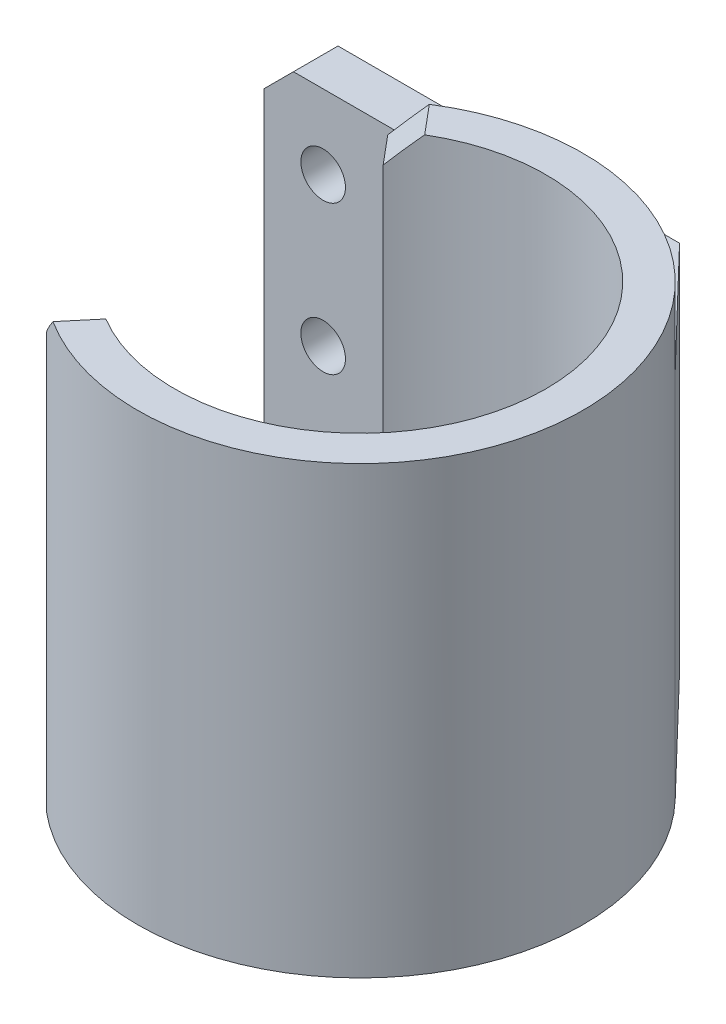
ISO-10303-21;
HEADER;
FILE_DESCRIPTION(('STEP AP214'),'2;1');
FILE_NAME('part.step','',(''),(''),'','','');
FILE_SCHEMA(('AUTOMOTIVE_DESIGN { 1 0 10303 214 1 1 1 1 }'));
ENDSEC;
DATA;
#1=APPLICATION_CONTEXT('core data for automotive mechanical design processes');
#2=APPLICATION_PROTOCOL_DEFINITION('international standard','automotive_design',2000,#1);
#3=PRODUCT_CONTEXT('',#1,'mechanical');
#4=PRODUCT('Part','Part','',(#3));
#5=PRODUCT_RELATED_PRODUCT_CATEGORY('part','',(#4));
#6=PRODUCT_DEFINITION_FORMATION('','',#4);
#7=PRODUCT_DEFINITION_CONTEXT('part definition',#1,'design');
#8=PRODUCT_DEFINITION('design','',#6,#7);
#9=PRODUCT_DEFINITION_SHAPE('','',#8);
#10=(LENGTH_UNIT() NAMED_UNIT(*) SI_UNIT(.MILLI.,.METRE.));
#11=(NAMED_UNIT(*) PLANE_ANGLE_UNIT() SI_UNIT($,.RADIAN.));
#12=(NAMED_UNIT(*) SI_UNIT($,.STERADIAN.) SOLID_ANGLE_UNIT());
#13=UNCERTAINTY_MEASURE_WITH_UNIT(LENGTH_MEASURE(1.E-05),#10,'distance_accuracy_value','');
#14=(GEOMETRIC_REPRESENTATION_CONTEXT(3) GLOBAL_UNCERTAINTY_ASSIGNED_CONTEXT((#13)) GLOBAL_UNIT_ASSIGNED_CONTEXT((#10,
#11,#12)) REPRESENTATION_CONTEXT('',''));
#15=CARTESIAN_POINT('',(0.,0.,0.));
#16=DIRECTION('',(0.,0.,1.));
#17=DIRECTION('',(1.,0.,0.));
#18=AXIS2_PLACEMENT_3D('',#15,#16,#17);
#19=CARTESIAN_POINT('',(0.,10.,0.));
#20=DIRECTION('',(0.,-1.,0.));
#21=DIRECTION('',(0.,0.,-1.));
#22=AXIS2_PLACEMENT_3D('',#19,#20,#21);
#23=CYLINDRICAL_SURFACE('',#22,6.25);
#24=DIRECTION('',(0.,1.,0.));
#25=VECTOR('',#24,1.);
#26=CARTESIAN_POINT('',(0.,0.,6.25));
#27=LINE('',#26,#25);
#28=CARTESIAN_POINT('',(0.,0.,6.25));
#29=VERTEX_POINT('',#28);
#30=CARTESIAN_POINT('',(0.,10.,6.25));
#31=VERTEX_POINT('',#30);
#32=EDGE_CURVE('E180',#29,#31,#27,.T.);
#33=ORIENTED_EDGE('',*,*,#32,.T.);
#34=CARTESIAN_POINT('',(0.,10.,0.));
#35=DIRECTION('',(0.,1.,0.));
#36=DIRECTION('',(0.,0.,1.));
#37=AXIS2_PLACEMENT_3D('',#34,#35,#36);
#38=CIRCLE('',#37,6.25);
#39=CARTESIAN_POINT('',(0.,10.,-6.25));
#40=VERTEX_POINT('',#39);
#41=EDGE_CURVE('E179',#31,#40,#38,.T.);
#42=ORIENTED_EDGE('',*,*,#41,.T.);
#43=DIRECTION('',(0.,1.,0.));
#44=VECTOR('',#43,1.);
#45=CARTESIAN_POINT('',(0.,0.,-6.25));
#46=LINE('',#45,#44);
#47=CARTESIAN_POINT('',(0.,0.,-6.25));
#48=VERTEX_POINT('',#47);
#49=EDGE_CURVE('E163',#48,#40,#46,.T.);
#50=ORIENTED_EDGE('',*,*,#49,.F.);
#51=CARTESIAN_POINT('',(0.,0.,0.));
#52=DIRECTION('',(0.,1.,0.));
#53=DIRECTION('',(0.,0.,1.));
#54=AXIS2_PLACEMENT_3D('',#51,#52,#53);
#55=CIRCLE('',#54,6.25);
#56=EDGE_CURVE('E177',#29,#48,#55,.T.);
#57=ORIENTED_EDGE('',*,*,#56,.F.);
#58=EDGE_LOOP('',(#33,#42,#50,#57));
#59=FACE_BOUND('',#58,.T.);
#60=ADVANCED_FACE('F47',(#59),#23,.F.);
#61=CARTESIAN_POINT('',(0.,10.,0.));
#62=DIRECTION('',(0.,-1.,0.));
#63=DIRECTION('',(0.,0.,-1.));
#64=AXIS2_PLACEMENT_3D('',#61,#62,#63);
#65=CYLINDRICAL_SURFACE('',#64,15.);
#66=CARTESIAN_POINT('',(0.,30.,0.));
#67=DIRECTION('',(0.,1.,0.));
#68=DIRECTION('',(0.,0.,1.));
#69=AXIS2_PLACEMENT_3D('',#66,#67,#68);
#70=CIRCLE('',#69,15.);
#71=CARTESIAN_POINT('',(-8.02363590928664,30.,12.6736445742811));
#72=VERTEX_POINT('',#71);
#73=CARTESIAN_POINT('',(-8.02363590928663,30.,-12.6736445742812));
#74=VERTEX_POINT('',#73);
#75=EDGE_CURVE('E185',#72,#74,#70,.T.);
#76=ORIENTED_EDGE('',*,*,#75,.F.);
#77=CARTESIAN_POINT('',(0.,28.,0.));
#78=DIRECTION('',(0.541675220419703,-0.707106781186547,0.454519477672043));
#79=DIRECTION('',(-0.541675220419703,-0.707106781186548,-0.454519477672043));
#80=AXIS2_PLACEMENT_3D('',#77,#78,#79);
#81=ELLIPSE('',#80,21.2132034355964,15.);
#82=CARTESIAN_POINT('',(-9.64181414529808,28.,11.4906666467847));
#83=VERTEX_POINT('',#82);
#84=EDGE_CURVE('E219',#72,#83,#81,.T.);
#85=ORIENTED_EDGE('',*,*,#84,.T.);
#86=DIRECTION('',(0.,-1.,0.));
#87=VECTOR('',#86,1.);
#88=CARTESIAN_POINT('',(-9.64181414529808,30.,11.4906666467847));
#89=LINE('',#88,#87);
#90=CARTESIAN_POINT('',(-9.64181414529808,0.,11.4906666467847));
#91=VERTEX_POINT('',#90);
#92=EDGE_CURVE('E282',#83,#91,#89,.T.);
#93=ORIENTED_EDGE('',*,*,#92,.T.);
#94=CARTESIAN_POINT('',(0.,0.,0.));
#95=DIRECTION('',(0.,1.,0.));
#96=DIRECTION('',(0.,0.,1.));
#97=AXIS2_PLACEMENT_3D('',#94,#95,#96);
#98=CIRCLE('',#97,15.);
#99=CARTESIAN_POINT('',(10.8113847429395,0.,-10.397786299984));
#100=VERTEX_POINT('',#99);
#101=EDGE_CURVE('E187',#91,#100,#98,.T.);
#102=ORIENTED_EDGE('',*,*,#101,.T.);
#103=DIRECTION('',(0.,-1.,0.));
#104=VECTOR('',#103,1.);
#105=CARTESIAN_POINT('',(10.8113847429395,25.,-10.397786299984));
#106=LINE('',#105,#104);
#107=CARTESIAN_POINT('',(10.8113847429395,25.,-10.397786299984));
#108=VERTEX_POINT('',#107);
#109=EDGE_CURVE('E275',#108,#100,#106,.T.);
#110=ORIENTED_EDGE('',*,*,#109,.F.);
#111=CARTESIAN_POINT('',(0.,25.,0.));
#112=DIRECTION('',(0.,-1.,0.));
#113=DIRECTION('',(0.,0.,1.));
#114=AXIS2_PLACEMENT_3D('',#111,#112,#113);
#115=CIRCLE('',#114,15.);
#116=CARTESIAN_POINT('',(-9.64181414529807,25.,-11.4906666467847));
#117=VERTEX_POINT('',#116);
#118=EDGE_CURVE('E264',#117,#108,#115,.T.);
#119=ORIENTED_EDGE('',*,*,#118,.F.);
#120=DIRECTION('',(0.,-1.,0.));
#121=VECTOR('',#120,1.);
#122=CARTESIAN_POINT('',(-9.64181414529807,30.,-11.4906666467847));
#123=LINE('',#122,#121);
#124=CARTESIAN_POINT('',(-9.64181414529807,28.,-11.4906666467847));
#125=VERTEX_POINT('',#124);
#126=EDGE_CURVE('E284',#125,#117,#123,.T.);
#127=ORIENTED_EDGE('',*,*,#126,.F.);
#128=CARTESIAN_POINT('',(0.,28.,0.));
#129=DIRECTION('',(0.541675220419702,-0.707106781186548,-0.454519477672043));
#130=DIRECTION('',(-0.541675220419703,-0.707106781186547,0.454519477672043));
#131=AXIS2_PLACEMENT_3D('',#128,#129,#130);
#132=ELLIPSE('',#131,21.2132034355964,15.);
#133=EDGE_CURVE('E217',#125,#74,#132,.T.);
#134=ORIENTED_EDGE('',*,*,#133,.T.);
#135=EDGE_LOOP('',(#76,#85,#93,#102,#110,#119,#127,#134));
#136=FACE_BOUND('',#135,.T.);
#137=ADVANCED_FACE('F310',(#136),#65,.T.);
#138=CARTESIAN_POINT('',(0.,10.,0.));
#139=DIRECTION('',(0.,1.,0.));
#140=DIRECTION('',(0.,0.,1.));
#141=AXIS2_PLACEMENT_3D('',#138,#139,#140);
#142=PLANE('',#141);
#143=DIRECTION('',(1.,0.,0.));
#144=VECTOR('',#143,1.);
#145=CARTESIAN_POINT('',(0.,10.,6.25));
#146=LINE('',#145,#144);
#147=CARTESIAN_POINT('',(-5.24437269485798,10.,6.25));
#148=VERTEX_POINT('',#147);
#149=EDGE_CURVE('E171',#148,#31,#146,.T.);
#150=ORIENTED_EDGE('',*,*,#149,.F.);
#151=DIRECTION('',(-0.642787609686538,0.,0.766044443118979));
#152=VECTOR('',#151,1.);
#153=CARTESIAN_POINT('',(0.,10.,0.));
#154=LINE('',#153,#152);
#155=CARTESIAN_POINT('',(-8.03484512108172,10.,9.57555553898724));
#156=VERTEX_POINT('',#155);
#157=EDGE_CURVE('E289',#148,#156,#154,.T.);
#158=ORIENTED_EDGE('',*,*,#157,.T.);
#159=CARTESIAN_POINT('',(0.,10.,0.));
#160=DIRECTION('',(0.,1.,0.));
#161=DIRECTION('',(0.,0.,1.));
#162=AXIS2_PLACEMENT_3D('',#159,#160,#161);
#163=CIRCLE('',#162,12.5);
#164=CARTESIAN_POINT('',(-8.03484512108173,10.,-9.57555553898724));
#165=VERTEX_POINT('',#164);
#166=EDGE_CURVE('E195',#165,#156,#163,.F.);
#167=ORIENTED_EDGE('',*,*,#166,.F.);
#168=DIRECTION('',(0.642787609686538,0.,0.766044443118979));
#169=VECTOR('',#168,1.);
#170=CARTESIAN_POINT('',(0.,10.,0.));
#171=LINE('',#170,#169);
#172=CARTESIAN_POINT('',(-5.24437269485799,10.,-6.25));
#173=VERTEX_POINT('',#172);
#174=EDGE_CURVE('E286',#165,#173,#171,.T.);
#175=ORIENTED_EDGE('',*,*,#174,.T.);
#176=DIRECTION('',(-1.,0.,0.));
#177=VECTOR('',#176,1.);
#178=CARTESIAN_POINT('',(0.,10.,-6.25));
#179=LINE('',#178,#177);
#180=EDGE_CURVE('E328',#40,#173,#179,.T.);
#181=ORIENTED_EDGE('',*,*,#180,.F.);
#182=ORIENTED_EDGE('',*,*,#41,.F.);
#183=EDGE_LOOP('',(#150,#158,#167,#175,#181,#182));
#184=FACE_BOUND('',#183,.T.);
#185=ADVANCED_FACE('F333',(#184),#142,.T.);
#186=CARTESIAN_POINT('',(0.,0.,0.));
#187=DIRECTION('',(0.,1.,0.));
#188=DIRECTION('',(0.,0.,1.));
#189=AXIS2_PLACEMENT_3D('',#186,#187,#188);
#190=PLANE('',#189);
#191=DIRECTION('',(0.642787609686538,0.,-0.766044443118979));
#192=VECTOR('',#191,1.);
#193=CARTESIAN_POINT('',(0.,0.,0.));
#194=LINE('',#193,#192);
#195=CARTESIAN_POINT('',(-5.24437269485798,0.,6.25));
#196=VERTEX_POINT('',#195);
#197=EDGE_CURVE('E278',#91,#196,#194,.T.);
#198=ORIENTED_EDGE('',*,*,#197,.T.);
#199=DIRECTION('',(1.,0.,0.));
#200=VECTOR('',#199,1.);
#201=CARTESIAN_POINT('',(0.,0.,6.25));
#202=LINE('',#201,#200);
#203=EDGE_CURVE('E170',#196,#29,#202,.T.);
#204=ORIENTED_EDGE('',*,*,#203,.T.);
#205=ORIENTED_EDGE('',*,*,#56,.T.);
#206=DIRECTION('',(-1.,0.,0.));
#207=VECTOR('',#206,1.);
#208=CARTESIAN_POINT('',(0.,0.,-6.25));
#209=LINE('',#208,#207);
#210=CARTESIAN_POINT('',(-5.24437269485798,0.,-6.25));
#211=VERTEX_POINT('',#210);
#212=EDGE_CURVE('E160',#48,#211,#209,.T.);
#213=ORIENTED_EDGE('',*,*,#212,.T.);
#214=DIRECTION('',(-0.642787609686538,0.,-0.766044443118979));
#215=VECTOR('',#214,1.);
#216=CARTESIAN_POINT('',(0.,0.,0.));
#217=LINE('',#216,#215);
#218=CARTESIAN_POINT('',(-9.64181414529807,0.,-11.4906666467847));
#219=VERTEX_POINT('',#218);
#220=EDGE_CURVE('E280',#211,#219,#217,.T.);
#221=ORIENTED_EDGE('',*,*,#220,.T.);
#222=DIRECTION('',(0.,0.,1.));
#223=VECTOR('',#222,1.);
#224=CARTESIAN_POINT('',(-9.64181414529807,0.,-11.4906666467847));
#225=LINE('',#224,#223);
#226=CARTESIAN_POINT('',(-9.64181414529807,0.,-15.));
#227=VERTEX_POINT('',#226);
#228=EDGE_CURVE('E261',#227,#219,#225,.T.);
#229=ORIENTED_EDGE('',*,*,#228,.F.);
#230=DIRECTION('',(1.,0.,0.));
#231=VECTOR('',#230,1.);
#232=CARTESIAN_POINT('',(-9.64181414529807,0.,-15.));
#233=LINE('',#232,#231);
#234=CARTESIAN_POINT('',(-21.5,0.,-15.));
#235=VERTEX_POINT('',#234);
#236=EDGE_CURVE('E259',#235,#227,#233,.T.);
#237=ORIENTED_EDGE('',*,*,#236,.F.);
#238=DIRECTION('',(0.,0.,1.));
#239=VECTOR('',#238,1.);
#240=CARTESIAN_POINT('',(-21.5,0.,-15.));
#241=LINE('',#240,#239);
#242=CARTESIAN_POINT('',(-21.5,0.,-18.));
#243=VERTEX_POINT('',#242);
#244=EDGE_CURVE('E256',#243,#235,#241,.T.);
#245=ORIENTED_EDGE('',*,*,#244,.F.);
#246=DIRECTION('',(-1.,0.,0.));
#247=VECTOR('',#246,1.);
#248=CARTESIAN_POINT('',(-21.5,0.,-18.));
#249=LINE('',#248,#247);
#250=CARTESIAN_POINT('',(3.5,0.,-18.));
#251=VERTEX_POINT('',#250);
#252=EDGE_CURVE('E252',#251,#243,#249,.T.);
#253=ORIENTED_EDGE('',*,*,#252,.F.);
#254=DIRECTION('',(-0.693185753332266,0.,-0.720758982862634));
#255=VECTOR('',#254,1.);
#256=CARTESIAN_POINT('',(3.5,0.,-18.));
#257=LINE('',#256,#255);
#258=EDGE_CURVE('E250',#100,#251,#257,.T.);
#259=ORIENTED_EDGE('',*,*,#258,.F.);
#260=ORIENTED_EDGE('',*,*,#101,.F.);
#261=EDGE_LOOP('',(#198,#204,#205,#213,#221,#229,#237,#245,#253,#259,#260));
#262=FACE_BOUND('',#261,.T.);
#263=ADVANCED_FACE('F184',(#262),#190,.F.);
#264=CARTESIAN_POINT('',(0.,30.,0.));
#265=DIRECTION('',(0.,1.,0.));
#266=DIRECTION('',(0.,0.,1.));
#267=AXIS2_PLACEMENT_3D('',#264,#265,#266);
#268=PLANE('',#267);
#269=CARTESIAN_POINT('',(0.,30.,0.));
#270=DIRECTION('',(0.,1.,0.));
#271=DIRECTION('',(0.,0.,1.));
#272=AXIS2_PLACEMENT_3D('',#269,#270,#271);
#273=CIRCLE('',#272,12.5);
#274=CARTESIAN_POINT('',(-6.39924344037051,30.,10.7377690136674));
#275=VERTEX_POINT('',#274);
#276=CARTESIAN_POINT('',(-6.3992434403705,30.,-10.7377690136674));
#277=VERTEX_POINT('',#276);
#278=EDGE_CURVE('E190',#275,#277,#273,.T.);
#279=ORIENTED_EDGE('',*,*,#278,.F.);
#280=DIRECTION('',(-0.642787609686538,0.,0.766044443118979));
#281=VECTOR('',#280,1.);
#282=CARTESIAN_POINT('',(1.53208888623797,30.,1.28557521937308));
#283=LINE('',#282,#281);
#284=EDGE_CURVE('E215',#275,#72,#283,.T.);
#285=ORIENTED_EDGE('',*,*,#284,.T.);
#286=ORIENTED_EDGE('',*,*,#75,.T.);
#287=DIRECTION('',(0.642787609686538,0.,0.766044443118979));
#288=VECTOR('',#287,1.);
#289=CARTESIAN_POINT('',(1.53208888623798,30.,-1.28557521937309));
#290=LINE('',#289,#288);
#291=EDGE_CURVE('E213',#74,#277,#290,.T.);
#292=ORIENTED_EDGE('',*,*,#291,.T.);
#293=EDGE_LOOP('',(#279,#285,#286,#292));
#294=FACE_BOUND('',#293,.T.);
#295=ADVANCED_FACE('F345',(#294),#268,.T.);
#296=CARTESIAN_POINT('',(0.,30.,0.));
#297=DIRECTION('',(0.,-1.,0.));
#298=DIRECTION('',(0.,0.,-1.));
#299=AXIS2_PLACEMENT_3D('',#296,#297,#298);
#300=CYLINDRICAL_SURFACE('',#299,12.5);
#301=DIRECTION('',(0.,-1.,0.));
#302=VECTOR('',#301,1.);
#303=CARTESIAN_POINT('',(-8.03484512108172,30.,9.57555553898724));
#304=LINE('',#303,#302);
#305=CARTESIAN_POINT('',(-8.03484512108172,28.,9.57555553898724));
#306=VERTEX_POINT('',#305);
#307=EDGE_CURVE('E200',#156,#306,#304,.F.);
#308=ORIENTED_EDGE('',*,*,#307,.T.);
#309=CARTESIAN_POINT('',(0.,28.,0.));
#310=DIRECTION('',(0.541675220419703,-0.707106781186547,0.454519477672043));
#311=DIRECTION('',(-0.541675220419703,-0.707106781186548,-0.454519477672043));
#312=AXIS2_PLACEMENT_3D('',#309,#310,#311);
#313=ELLIPSE('',#312,17.6776695296637,12.5);
#314=EDGE_CURVE('E211',#306,#275,#313,.F.);
#315=ORIENTED_EDGE('',*,*,#314,.T.);
#316=ORIENTED_EDGE('',*,*,#278,.T.);
#317=CARTESIAN_POINT('',(0.,28.,0.));
#318=DIRECTION('',(0.541675220419702,-0.707106781186548,-0.454519477672043));
#319=DIRECTION('',(-0.541675220419703,-0.707106781186547,0.454519477672043));
#320=AXIS2_PLACEMENT_3D('',#317,#318,#319);
#321=ELLIPSE('',#320,17.6776695296637,12.5);
#322=CARTESIAN_POINT('',(-8.03484512108173,28.,-9.57555553898724));
#323=VERTEX_POINT('',#322);
#324=EDGE_CURVE('E209',#277,#323,#321,.F.);
#325=ORIENTED_EDGE('',*,*,#324,.T.);
#326=DIRECTION('',(0.,-1.,0.));
#327=VECTOR('',#326,1.);
#328=CARTESIAN_POINT('',(-8.03484512108173,30.,-9.57555553898724));
#329=LINE('',#328,#327);
#330=EDGE_CURVE('E198',#323,#165,#329,.T.);
#331=ORIENTED_EDGE('',*,*,#330,.T.);
#332=ORIENTED_EDGE('',*,*,#166,.T.);
#333=EDGE_LOOP('',(#308,#315,#316,#325,#331,#332));
#334=FACE_BOUND('',#333,.T.);
#335=ADVANCED_FACE('F295',(#334),#300,.F.);
#336=CARTESIAN_POINT('',(0.,30.,0.));
#337=DIRECTION('',(-0.766044443118979,0.,0.642787609686538));
#338=DIRECTION('',(0.642787609686538,0.,0.766044443118979));
#339=AXIS2_PLACEMENT_3D('',#336,#337,#338);
#340=PLANE('',#339);
#341=ORIENTED_EDGE('',*,*,#330,.F.);
#342=DIRECTION('',(-0.642787609686538,0.,-0.766044443118979));
#343=VECTOR('',#342,1.);
#344=CARTESIAN_POINT('',(0.,28.,0.));
#345=LINE('',#344,#343);
#346=EDGE_CURVE('E221',#323,#125,#345,.T.);
#347=ORIENTED_EDGE('',*,*,#346,.T.);
#348=ORIENTED_EDGE('',*,*,#126,.T.);
#349=DIRECTION('',(0.,-1.,0.));
#350=VECTOR('',#349,1.);
#351=CARTESIAN_POINT('',(-9.64181414529807,25.,-11.4906666467847));
#352=LINE('',#351,#350);
#353=EDGE_CURVE('E244',#117,#219,#352,.T.);
#354=ORIENTED_EDGE('',*,*,#353,.T.);
#355=ORIENTED_EDGE('',*,*,#220,.F.);
#356=DIRECTION('',(0.,-1.,0.));
#357=VECTOR('',#356,1.);
#358=CARTESIAN_POINT('',(-5.24437269485798,30.,-6.25));
#359=LINE('',#358,#357);
#360=EDGE_CURVE('E166',#173,#211,#359,.T.);
#361=ORIENTED_EDGE('',*,*,#360,.F.);
#362=ORIENTED_EDGE('',*,*,#174,.F.);
#363=EDGE_LOOP('',(#341,#347,#348,#354,#355,#361,#362));
#364=FACE_BOUND('',#363,.T.);
#365=ADVANCED_FACE('F305',(#364),#340,.T.);
#366=CARTESIAN_POINT('',(0.,30.,0.));
#367=DIRECTION('',(-0.766044443118979,0.,-0.642787609686538));
#368=DIRECTION('',(-0.642787609686538,0.,0.766044443118979));
#369=AXIS2_PLACEMENT_3D('',#366,#367,#368);
#370=PLANE('',#369);
#371=ORIENTED_EDGE('',*,*,#92,.F.);
#372=DIRECTION('',(0.642787609686538,0.,-0.766044443118979));
#373=VECTOR('',#372,1.);
#374=CARTESIAN_POINT('',(0.,28.,0.));
#375=LINE('',#374,#373);
#376=EDGE_CURVE('E206',#83,#306,#375,.T.);
#377=ORIENTED_EDGE('',*,*,#376,.T.);
#378=ORIENTED_EDGE('',*,*,#307,.F.);
#379=ORIENTED_EDGE('',*,*,#157,.F.);
#380=DIRECTION('',(0.,1.,0.));
#381=VECTOR('',#380,1.);
#382=CARTESIAN_POINT('',(-5.24437269485798,30.,6.25));
#383=LINE('',#382,#381);
#384=EDGE_CURVE('E203',#196,#148,#383,.T.);
#385=ORIENTED_EDGE('',*,*,#384,.F.);
#386=ORIENTED_EDGE('',*,*,#197,.F.);
#387=EDGE_LOOP('',(#371,#377,#378,#379,#385,#386));
#388=FACE_BOUND('',#387,.T.);
#389=ADVANCED_FACE('F338',(#388),#370,.T.);
#390=CARTESIAN_POINT('',(3.5,25.,-18.));
#391=DIRECTION('',(-0.720758982862634,0.,0.693185753332266));
#392=DIRECTION('',(0.693185753332266,0.,0.720758982862634));
#393=AXIS2_PLACEMENT_3D('',#390,#391,#392);
#394=PLANE('',#393);
#395=ORIENTED_EDGE('',*,*,#258,.T.);
#396=DIRECTION('',(0.,-1.,0.));
#397=VECTOR('',#396,1.);
#398=CARTESIAN_POINT('',(3.5,25.,-18.));
#399=LINE('',#398,#397);
#400=CARTESIAN_POINT('',(3.5,25.,-18.));
#401=VERTEX_POINT('',#400);
#402=EDGE_CURVE('E272',#401,#251,#399,.T.);
#403=ORIENTED_EDGE('',*,*,#402,.F.);
#404=DIRECTION('',(-0.693185753332266,0.,-0.720758982862634));
#405=VECTOR('',#404,1.);
#406=CARTESIAN_POINT('',(3.5,25.,-18.));
#407=LINE('',#406,#405);
#408=EDGE_CURVE('E246',#108,#401,#407,.T.);
#409=ORIENTED_EDGE('',*,*,#408,.F.);
#410=ORIENTED_EDGE('',*,*,#109,.T.);
#411=EDGE_LOOP('',(#395,#403,#409,#410));
#412=FACE_BOUND('',#411,.T.);
#413=ADVANCED_FACE('F351',(#412),#394,.F.);
#414=CARTESIAN_POINT('',(-21.5,25.,-18.));
#415=DIRECTION('',(0.,0.,1.));
#416=DIRECTION('',(1.,0.,0.));
#417=AXIS2_PLACEMENT_3D('',#414,#415,#416);
#418=PLANE('',#417);
#419=CARTESIAN_POINT('',(-17.5,10.,-18.));
#420=DIRECTION('',(0.,0.,1.));
#421=DIRECTION('',(1.,0.,0.));
#422=AXIS2_PLACEMENT_3D('',#419,#420,#421);
#423=CIRCLE('',#422,1.5);
#424=CARTESIAN_POINT('',(-16.,10.,-18.));
#425=VERTEX_POINT('',#424);
#426=EDGE_CURVE('E318',#425,#425,#423,.T.);
#427=ORIENTED_EDGE('',*,*,#426,.T.);
#428=EDGE_LOOP('',(#427));
#429=FACE_BOUND('',#428,.T.);
#430=CARTESIAN_POINT('',(-17.5,20.,-18.));
#431=DIRECTION('',(0.,0.,1.));
#432=DIRECTION('',(1.,0.,0.));
#433=AXIS2_PLACEMENT_3D('',#430,#431,#432);
#434=CIRCLE('',#433,1.5);
#435=CARTESIAN_POINT('',(-16.,20.,-18.));
#436=VERTEX_POINT('',#435);
#437=EDGE_CURVE('E253',#436,#436,#434,.T.);
#438=ORIENTED_EDGE('',*,*,#437,.T.);
#439=EDGE_LOOP('',(#438));
#440=FACE_BOUND('',#439,.T.);
#441=DIRECTION('',(0.,-1.,0.));
#442=VECTOR('',#441,1.);
#443=CARTESIAN_POINT('',(-21.5,25.,-18.));
#444=LINE('',#443,#442);
#445=CARTESIAN_POINT('',(-21.5,23.,-18.));
#446=VERTEX_POINT('',#445);
#447=EDGE_CURVE('E270',#446,#243,#444,.T.);
#448=ORIENTED_EDGE('',*,*,#447,.F.);
#449=DIRECTION('',(0.707106781186546,0.707106781186549,0.));
#450=VECTOR('',#449,1.);
#451=CARTESIAN_POINT('',(-19.5,25.,-18.));
#452=LINE('',#451,#450);
#453=CARTESIAN_POINT('',(-19.5,25.,-18.));
#454=VERTEX_POINT('',#453);
#455=EDGE_CURVE('E13',#446,#454,#452,.T.);
#456=ORIENTED_EDGE('',*,*,#455,.T.);
#457=DIRECTION('',(-1.,0.,0.));
#458=VECTOR('',#457,1.);
#459=CARTESIAN_POINT('',(-21.5,25.,-18.));
#460=LINE('',#459,#458);
#461=EDGE_CURVE('E235',#401,#454,#460,.T.);
#462=ORIENTED_EDGE('',*,*,#461,.F.);
#463=ORIENTED_EDGE('',*,*,#402,.T.);
#464=ORIENTED_EDGE('',*,*,#252,.T.);
#465=EDGE_LOOP('',(#448,#456,#462,#463,#464));
#466=FACE_BOUND('',#465,.T.);
#467=ADVANCED_FACE('F353',(#429,#440,#466),#418,.F.);
#468=CARTESIAN_POINT('',(-21.5,25.,-15.));
#469=DIRECTION('',(1.,0.,0.));
#470=DIRECTION('',(0.,0.,-1.));
#471=AXIS2_PLACEMENT_3D('',#468,#469,#470);
#472=PLANE('',#471);
#473=DIRECTION('',(0.,-1.,0.));
#474=VECTOR('',#473,1.);
#475=CARTESIAN_POINT('',(-21.5,25.,-15.));
#476=LINE('',#475,#474);
#477=CARTESIAN_POINT('',(-21.5,23.,-15.));
#478=VERTEX_POINT('',#477);
#479=EDGE_CURVE('E268',#478,#235,#476,.T.);
#480=ORIENTED_EDGE('',*,*,#479,.F.);
#481=DIRECTION('',(0.,0.,-1.));
#482=VECTOR('',#481,1.);
#483=CARTESIAN_POINT('',(-21.5,23.,-18.));
#484=LINE('',#483,#482);
#485=EDGE_CURVE('E55',#478,#446,#484,.T.);
#486=ORIENTED_EDGE('',*,*,#485,.T.);
#487=ORIENTED_EDGE('',*,*,#447,.T.);
#488=ORIENTED_EDGE('',*,*,#244,.T.);
#489=EDGE_LOOP('',(#480,#486,#487,#488));
#490=FACE_BOUND('',#489,.T.);
#491=ADVANCED_FACE('F399',(#490),#472,.F.);
#492=CARTESIAN_POINT('',(-9.64181414529807,25.,-15.));
#493=DIRECTION('',(0.,0.,-1.));
#494=DIRECTION('',(-1.,0.,0.));
#495=AXIS2_PLACEMENT_3D('',#492,#493,#494);
#496=PLANE('',#495);
#497=CARTESIAN_POINT('',(-17.5,10.,-15.));
#498=DIRECTION('',(0.,0.,1.));
#499=DIRECTION('',(1.,0.,0.));
#500=AXIS2_PLACEMENT_3D('',#497,#498,#499);
#501=CIRCLE('',#500,1.5);
#502=CARTESIAN_POINT('',(-16.,10.,-15.));
#503=VERTEX_POINT('',#502);
#504=EDGE_CURVE('E321',#503,#503,#501,.T.);
#505=ORIENTED_EDGE('',*,*,#504,.F.);
#506=EDGE_LOOP('',(#505));
#507=FACE_BOUND('',#506,.T.);
#508=CARTESIAN_POINT('',(-17.5,20.,-15.));
#509=DIRECTION('',(0.,0.,1.));
#510=DIRECTION('',(1.,0.,0.));
#511=AXIS2_PLACEMENT_3D('',#508,#509,#510);
#512=CIRCLE('',#511,1.5);
#513=CARTESIAN_POINT('',(-16.,20.,-15.));
#514=VERTEX_POINT('',#513);
#515=EDGE_CURVE('E315',#514,#514,#512,.T.);
#516=ORIENTED_EDGE('',*,*,#515,.F.);
#517=EDGE_LOOP('',(#516));
#518=FACE_BOUND('',#517,.T.);
#519=DIRECTION('',(1.,0.,0.));
#520=VECTOR('',#519,1.);
#521=CARTESIAN_POINT('',(-9.64181414529807,25.,-15.));
#522=LINE('',#521,#520);
#523=CARTESIAN_POINT('',(-19.5,25.,-15.));
#524=VERTEX_POINT('',#523);
#525=CARTESIAN_POINT('',(-9.64181414529807,25.,-15.));
#526=VERTEX_POINT('',#525);
#527=EDGE_CURVE('E232',#524,#526,#522,.T.);
#528=ORIENTED_EDGE('',*,*,#527,.F.);
#529=DIRECTION('',(-0.707106781186546,-0.707106781186549,0.));
#530=VECTOR('',#529,1.);
#531=CARTESIAN_POINT('',(-19.5,25.,-15.));
#532=LINE('',#531,#530);
#533=EDGE_CURVE('E69',#524,#478,#532,.T.);
#534=ORIENTED_EDGE('',*,*,#533,.T.);
#535=ORIENTED_EDGE('',*,*,#479,.T.);
#536=ORIENTED_EDGE('',*,*,#236,.T.);
#537=DIRECTION('',(0.,-1.,0.));
#538=VECTOR('',#537,1.);
#539=CARTESIAN_POINT('',(-9.64181414529807,25.,-15.));
#540=LINE('',#539,#538);
#541=EDGE_CURVE('E240',#526,#227,#540,.T.);
#542=ORIENTED_EDGE('',*,*,#541,.F.);
#543=EDGE_LOOP('',(#528,#534,#535,#536,#542));
#544=FACE_BOUND('',#543,.T.);
#545=ADVANCED_FACE('F238',(#507,#518,#544),#496,.F.);
#546=CARTESIAN_POINT('',(-9.64181414529807,25.,-11.4906666467847));
#547=DIRECTION('',(1.,0.,0.));
#548=DIRECTION('',(0.,0.,-1.));
#549=AXIS2_PLACEMENT_3D('',#546,#547,#548);
#550=PLANE('',#549);
#551=ORIENTED_EDGE('',*,*,#228,.T.);
#552=ORIENTED_EDGE('',*,*,#353,.F.);
#553=DIRECTION('',(0.,0.,1.));
#554=VECTOR('',#553,1.);
#555=CARTESIAN_POINT('',(-9.64181414529807,25.,-11.4906666467847));
#556=LINE('',#555,#554);
#557=EDGE_CURVE('E242',#526,#117,#556,.T.);
#558=ORIENTED_EDGE('',*,*,#557,.F.);
#559=ORIENTED_EDGE('',*,*,#541,.T.);
#560=EDGE_LOOP('',(#551,#552,#558,#559));
#561=FACE_BOUND('',#560,.T.);
#562=ADVANCED_FACE('F393',(#561),#550,.F.);
#563=CARTESIAN_POINT('',(0.,25.,0.));
#564=DIRECTION('',(0.,1.,0.));
#565=DIRECTION('',(0.,0.,1.));
#566=AXIS2_PLACEMENT_3D('',#563,#564,#565);
#567=PLANE('',#566);
#568=ORIENTED_EDGE('',*,*,#461,.T.);
#569=DIRECTION('',(0.,0.,1.));
#570=VECTOR('',#569,1.);
#571=CARTESIAN_POINT('',(-19.5,25.,-15.));
#572=LINE('',#571,#570);
#573=EDGE_CURVE('E224',#454,#524,#572,.T.);
#574=ORIENTED_EDGE('',*,*,#573,.T.);
#575=ORIENTED_EDGE('',*,*,#527,.T.);
#576=ORIENTED_EDGE('',*,*,#557,.T.);
#577=ORIENTED_EDGE('',*,*,#118,.T.);
#578=ORIENTED_EDGE('',*,*,#408,.T.);
#579=EDGE_LOOP('',(#568,#574,#575,#576,#577,#578));
#580=FACE_BOUND('',#579,.T.);
#581=ADVANCED_FACE('F230',(#580),#567,.T.);
#582=CARTESIAN_POINT('',(-17.5,20.,-18.));
#583=DIRECTION('',(0.,0.,1.));
#584=DIRECTION('',(1.,0.,0.));
#585=AXIS2_PLACEMENT_3D('',#582,#583,#584);
#586=CYLINDRICAL_SURFACE('',#585,1.5);
#587=CARTESIAN_POINT('',(-16.,20.,-18.));
#588=CARTESIAN_POINT('',(-16.,20.,-17.96875));
#589=CARTESIAN_POINT('',(-16.,20.,-17.9375));
#590=CARTESIAN_POINT('',(-16.,20.,-17.875));
#591=CARTESIAN_POINT('',(-16.,20.,-17.84375));
#592=CARTESIAN_POINT('',(-16.,20.,-17.78125));
#593=CARTESIAN_POINT('',(-16.,20.,-17.75));
#594=CARTESIAN_POINT('',(-16.,20.,-17.6875));
#595=CARTESIAN_POINT('',(-16.,20.,-17.65625));
#596=CARTESIAN_POINT('',(-16.,20.,-17.59375));
#597=CARTESIAN_POINT('',(-16.,20.,-17.5625));
#598=CARTESIAN_POINT('',(-16.,20.,-17.5));
#599=CARTESIAN_POINT('',(-16.,20.,-17.46875));
#600=CARTESIAN_POINT('',(-16.,20.,-17.40625));
#601=CARTESIAN_POINT('',(-16.,20.,-17.375));
#602=CARTESIAN_POINT('',(-16.,20.,-17.3125));
#603=CARTESIAN_POINT('',(-16.,20.,-17.28125));
#604=CARTESIAN_POINT('',(-16.,20.,-17.21875));
#605=CARTESIAN_POINT('',(-16.,20.,-17.1875));
#606=CARTESIAN_POINT('',(-16.,20.,-17.125));
#607=CARTESIAN_POINT('',(-16.,20.,-17.09375));
#608=CARTESIAN_POINT('',(-16.,20.,-17.03125));
#609=CARTESIAN_POINT('',(-16.,20.,-17.));
#610=CARTESIAN_POINT('',(-16.,20.,-16.9375));
#611=CARTESIAN_POINT('',(-16.,20.,-16.90625));
#612=CARTESIAN_POINT('',(-16.,20.,-16.84375));
#613=CARTESIAN_POINT('',(-16.,20.,-16.8125));
#614=CARTESIAN_POINT('',(-16.,20.,-16.75));
#615=CARTESIAN_POINT('',(-16.,20.,-16.71875));
#616=CARTESIAN_POINT('',(-16.,20.,-16.65625));
#617=CARTESIAN_POINT('',(-16.,20.,-16.625));
#618=CARTESIAN_POINT('',(-16.,20.,-16.5625));
#619=CARTESIAN_POINT('',(-16.,20.,-16.53125));
#620=CARTESIAN_POINT('',(-16.,20.,-16.46875));
#621=CARTESIAN_POINT('',(-16.,20.,-16.4375));
#622=CARTESIAN_POINT('',(-16.,20.,-16.375));
#623=CARTESIAN_POINT('',(-16.,20.,-16.34375));
#624=CARTESIAN_POINT('',(-16.,20.,-16.28125));
#625=CARTESIAN_POINT('',(-16.,20.,-16.25));
#626=CARTESIAN_POINT('',(-16.,20.,-16.1875));
#627=CARTESIAN_POINT('',(-16.,20.,-16.15625));
#628=CARTESIAN_POINT('',(-16.,20.,-16.09375));
#629=CARTESIAN_POINT('',(-16.,20.,-16.0625));
#630=CARTESIAN_POINT('',(-16.,20.,-16.));
#631=CARTESIAN_POINT('',(-16.,20.,-15.96875));
#632=CARTESIAN_POINT('',(-16.,20.,-15.90625));
#633=CARTESIAN_POINT('',(-16.,20.,-15.875));
#634=CARTESIAN_POINT('',(-16.,20.,-15.8125));
#635=CARTESIAN_POINT('',(-16.,20.,-15.78125));
#636=CARTESIAN_POINT('',(-16.,20.,-15.71875));
#637=CARTESIAN_POINT('',(-16.,20.,-15.6875));
#638=CARTESIAN_POINT('',(-16.,20.,-15.625));
#639=CARTESIAN_POINT('',(-16.,20.,-15.59375));
#640=CARTESIAN_POINT('',(-16.,20.,-15.53125));
#641=CARTESIAN_POINT('',(-16.,20.,-15.5));
#642=CARTESIAN_POINT('',(-16.,20.,-15.4375));
#643=CARTESIAN_POINT('',(-16.,20.,-15.40625));
#644=CARTESIAN_POINT('',(-16.,20.,-15.34375));
#645=CARTESIAN_POINT('',(-16.,20.,-15.3125));
#646=CARTESIAN_POINT('',(-16.,20.,-15.25));
#647=CARTESIAN_POINT('',(-16.,20.,-15.21875));
#648=CARTESIAN_POINT('',(-16.,20.,-15.15625));
#649=CARTESIAN_POINT('',(-16.,20.,-15.125));
#650=CARTESIAN_POINT('',(-16.,20.,-15.0625));
#651=CARTESIAN_POINT('',(-16.,20.,-15.03125));
#652=CARTESIAN_POINT('',(-16.,20.,-15.));
#653=B_SPLINE_CURVE_WITH_KNOTS('',3,(#587,#588,#589,#590,#591,#592,#593,#594,#595,#596,#597,
#598,#599,#600,#601,#602,#603,#604,#605,#606,#607,#608,#609,#610,#611,#612,#613,#614,#615,#616,
#617,#618,#619,#620,#621,#622,#623,#624,#625,#626,#627,#628,#629,#630,#631,#632,#633,#634,#635,
#636,#637,#638,#639,#640,#641,#642,#643,#644,#645,#646,#647,#648,#649,#650,#651,#652),
.UNSPECIFIED.,.F.,.F.,(4,2,2,2,2,2,2,2,2,2,2,2,2,2,2,2,2,2,2,2,2,2,2,2,2,2,2,2,2,2,2,2,4),(0.,
0.0937499999999966,0.187499999999997,0.281249999999997,0.374999999999997,0.468749999999997,
0.562499999999997,0.656249999999997,0.749999999999997,0.843749999999997,0.937499999999997,
1.03125,1.12499999999999,1.21874999999999,1.31249999999999,1.40624999999999,1.49999999999999,
1.59374999999999,1.68749999999999,1.78124999999999,1.87499999999999,1.96874999999999,
2.06249999999999,2.15624999999999,2.24999999999999,2.34374999999999,2.43749999999999,
2.53124999999999,2.62499999999999,2.71874999999999,2.81249999999999,2.90624999999999,
2.99999999999999),.UNSPECIFIED.);
#654=EDGE_CURVE('BSEAM386',#436,#514,#653,.T.);
#655=ORIENTED_EDGE('',*,*,#437,.F.);
#656=ORIENTED_EDGE('',*,*,#515,.T.);
#657=ORIENTED_EDGE('',*,*,#654,.T.);
#658=ORIENTED_EDGE('',*,*,#654,.F.);
#659=EDGE_LOOP('',(#655,#657,#656,#658));
#660=FACE_BOUND('',#659,.T.);
#661=ADVANCED_FACE('F386',(#660),#586,.F.);
#662=CARTESIAN_POINT('',(-17.5,10.,-18.));
#663=DIRECTION('',(0.,0.,1.));
#664=DIRECTION('',(1.,0.,0.));
#665=AXIS2_PLACEMENT_3D('',#662,#663,#664);
#666=CYLINDRICAL_SURFACE('',#665,1.5);
#667=CARTESIAN_POINT('',(-16.,10.,-18.));
#668=CARTESIAN_POINT('',(-16.,10.,-17.96875));
#669=CARTESIAN_POINT('',(-16.,10.,-17.9375));
#670=CARTESIAN_POINT('',(-16.,10.,-17.875));
#671=CARTESIAN_POINT('',(-16.,10.,-17.84375));
#672=CARTESIAN_POINT('',(-16.,10.,-17.78125));
#673=CARTESIAN_POINT('',(-16.,10.,-17.75));
#674=CARTESIAN_POINT('',(-16.,10.,-17.6875));
#675=CARTESIAN_POINT('',(-16.,10.,-17.65625));
#676=CARTESIAN_POINT('',(-16.,10.,-17.59375));
#677=CARTESIAN_POINT('',(-16.,10.,-17.5625));
#678=CARTESIAN_POINT('',(-16.,10.,-17.5));
#679=CARTESIAN_POINT('',(-16.,10.,-17.46875));
#680=CARTESIAN_POINT('',(-16.,10.,-17.40625));
#681=CARTESIAN_POINT('',(-16.,10.,-17.375));
#682=CARTESIAN_POINT('',(-16.,10.,-17.3125));
#683=CARTESIAN_POINT('',(-16.,10.,-17.28125));
#684=CARTESIAN_POINT('',(-16.,10.,-17.21875));
#685=CARTESIAN_POINT('',(-16.,10.,-17.1875));
#686=CARTESIAN_POINT('',(-16.,10.,-17.125));
#687=CARTESIAN_POINT('',(-16.,10.,-17.09375));
#688=CARTESIAN_POINT('',(-16.,10.,-17.03125));
#689=CARTESIAN_POINT('',(-16.,10.,-17.));
#690=CARTESIAN_POINT('',(-16.,10.,-16.9375));
#691=CARTESIAN_POINT('',(-16.,10.,-16.90625));
#692=CARTESIAN_POINT('',(-16.,10.,-16.84375));
#693=CARTESIAN_POINT('',(-16.,10.,-16.8125));
#694=CARTESIAN_POINT('',(-16.,10.,-16.75));
#695=CARTESIAN_POINT('',(-16.,10.,-16.71875));
#696=CARTESIAN_POINT('',(-16.,10.,-16.65625));
#697=CARTESIAN_POINT('',(-16.,10.,-16.625));
#698=CARTESIAN_POINT('',(-16.,10.,-16.5625));
#699=CARTESIAN_POINT('',(-16.,10.,-16.53125));
#700=CARTESIAN_POINT('',(-16.,10.,-16.46875));
#701=CARTESIAN_POINT('',(-16.,10.,-16.4375));
#702=CARTESIAN_POINT('',(-16.,10.,-16.375));
#703=CARTESIAN_POINT('',(-16.,10.,-16.34375));
#704=CARTESIAN_POINT('',(-16.,10.,-16.28125));
#705=CARTESIAN_POINT('',(-16.,10.,-16.25));
#706=CARTESIAN_POINT('',(-16.,10.,-16.1875));
#707=CARTESIAN_POINT('',(-16.,10.,-16.15625));
#708=CARTESIAN_POINT('',(-16.,10.,-16.09375));
#709=CARTESIAN_POINT('',(-16.,10.,-16.0625));
#710=CARTESIAN_POINT('',(-16.,10.,-16.));
#711=CARTESIAN_POINT('',(-16.,10.,-15.96875));
#712=CARTESIAN_POINT('',(-16.,10.,-15.90625));
#713=CARTESIAN_POINT('',(-16.,10.,-15.875));
#714=CARTESIAN_POINT('',(-16.,10.,-15.8125));
#715=CARTESIAN_POINT('',(-16.,10.,-15.78125));
#716=CARTESIAN_POINT('',(-16.,10.,-15.71875));
#717=CARTESIAN_POINT('',(-16.,10.,-15.6875));
#718=CARTESIAN_POINT('',(-16.,10.,-15.625));
#719=CARTESIAN_POINT('',(-16.,10.,-15.59375));
#720=CARTESIAN_POINT('',(-16.,10.,-15.53125));
#721=CARTESIAN_POINT('',(-16.,10.,-15.5));
#722=CARTESIAN_POINT('',(-16.,10.,-15.4375));
#723=CARTESIAN_POINT('',(-16.,10.,-15.40625));
#724=CARTESIAN_POINT('',(-16.,10.,-15.34375));
#725=CARTESIAN_POINT('',(-16.,10.,-15.3125));
#726=CARTESIAN_POINT('',(-16.,10.,-15.25));
#727=CARTESIAN_POINT('',(-16.,10.,-15.21875));
#728=CARTESIAN_POINT('',(-16.,10.,-15.15625));
#729=CARTESIAN_POINT('',(-16.,10.,-15.125));
#730=CARTESIAN_POINT('',(-16.,10.,-15.0625));
#731=CARTESIAN_POINT('',(-16.,10.,-15.03125));
#732=CARTESIAN_POINT('',(-16.,10.,-15.));
#733=B_SPLINE_CURVE_WITH_KNOTS('',3,(#667,#668,#669,#670,#671,#672,#673,#674,#675,#676,#677,
#678,#679,#680,#681,#682,#683,#684,#685,#686,#687,#688,#689,#690,#691,#692,#693,#694,#695,#696,
#697,#698,#699,#700,#701,#702,#703,#704,#705,#706,#707,#708,#709,#710,#711,#712,#713,#714,#715,
#716,#717,#718,#719,#720,#721,#722,#723,#724,#725,#726,#727,#728,#729,#730,#731,#732),
.UNSPECIFIED.,.F.,.F.,(4,2,2,2,2,2,2,2,2,2,2,2,2,2,2,2,2,2,2,2,2,2,2,2,2,2,2,2,2,2,2,2,4),(0.,
0.0937499999999966,0.187499999999997,0.281249999999997,0.374999999999997,0.468749999999997,
0.562499999999997,0.656249999999997,0.749999999999997,0.843749999999997,0.937499999999997,
1.03125,1.12499999999999,1.21874999999999,1.31249999999999,1.40624999999999,1.49999999999999,
1.59374999999999,1.68749999999999,1.78124999999999,1.87499999999999,1.96874999999999,
2.06249999999999,2.15624999999999,2.24999999999999,2.34374999999999,2.43749999999999,
2.53124999999999,2.62499999999999,2.71874999999999,2.81249999999999,2.90624999999999,
2.99999999999999),.UNSPECIFIED.);
#734=EDGE_CURVE('BSEAM380',#425,#503,#733,.T.);
#735=ORIENTED_EDGE('',*,*,#426,.F.);
#736=ORIENTED_EDGE('',*,*,#504,.T.);
#737=ORIENTED_EDGE('',*,*,#734,.T.);
#738=ORIENTED_EDGE('',*,*,#734,.F.);
#739=EDGE_LOOP('',(#735,#737,#736,#738));
#740=FACE_BOUND('',#739,.T.);
#741=ADVANCED_FACE('F380',(#740),#666,.F.);
#742=CARTESIAN_POINT('',(0.,0.,6.25));
#743=DIRECTION('',(0.,0.,1.));
#744=DIRECTION('',(1.,0.,0.));
#745=AXIS2_PLACEMENT_3D('',#742,#743,#744);
#746=PLANE('',#745);
#747=ORIENTED_EDGE('',*,*,#384,.T.);
#748=ORIENTED_EDGE('',*,*,#149,.T.);
#749=ORIENTED_EDGE('',*,*,#32,.F.);
#750=ORIENTED_EDGE('',*,*,#203,.F.);
#751=EDGE_LOOP('',(#747,#748,#749,#750));
#752=FACE_BOUND('',#751,.T.);
#753=ADVANCED_FACE('F375',(#752),#746,.F.);
#754=CARTESIAN_POINT('',(0.,0.,-6.25));
#755=DIRECTION('',(0.,0.,-1.));
#756=DIRECTION('',(-1.,0.,0.));
#757=AXIS2_PLACEMENT_3D('',#754,#755,#756);
#758=PLANE('',#757);
#759=ORIENTED_EDGE('',*,*,#360,.T.);
#760=ORIENTED_EDGE('',*,*,#212,.F.);
#761=ORIENTED_EDGE('',*,*,#49,.T.);
#762=ORIENTED_EDGE('',*,*,#180,.T.);
#763=EDGE_LOOP('',(#759,#760,#761,#762));
#764=FACE_BOUND('',#763,.T.);
#765=ADVANCED_FACE('F162',(#764),#758,.F.);
#766=CARTESIAN_POINT('',(0.,28.,0.));
#767=DIRECTION('',(0.541675220419703,-0.707106781186547,0.454519477672043));
#768=DIRECTION('',(0.642787609686538,0.,-0.766044443118979));
#769=AXIS2_PLACEMENT_3D('',#766,#767,#768);
#770=PLANE('',#769);
#771=ORIENTED_EDGE('',*,*,#84,.F.);
#772=ORIENTED_EDGE('',*,*,#284,.F.);
#773=ORIENTED_EDGE('',*,*,#314,.F.);
#774=ORIENTED_EDGE('',*,*,#376,.F.);
#775=EDGE_LOOP('',(#771,#772,#773,#774));
#776=FACE_BOUND('',#775,.T.);
#777=ADVANCED_FACE('F344',(#776),#770,.F.);
#778=CARTESIAN_POINT('',(0.,28.,0.));
#779=DIRECTION('',(0.541675220419702,-0.707106781186548,-0.454519477672043));
#780=DIRECTION('',(-0.642787609686538,0.,-0.766044443118979));
#781=AXIS2_PLACEMENT_3D('',#778,#779,#780);
#782=PLANE('',#781);
#783=ORIENTED_EDGE('',*,*,#324,.F.);
#784=ORIENTED_EDGE('',*,*,#291,.F.);
#785=ORIENTED_EDGE('',*,*,#133,.F.);
#786=ORIENTED_EDGE('',*,*,#346,.F.);
#787=EDGE_LOOP('',(#783,#784,#785,#786));
#788=FACE_BOUND('',#787,.T.);
#789=ADVANCED_FACE('F302',(#788),#782,.F.);
#790=CARTESIAN_POINT('',(-19.5,25.,0.));
#791=DIRECTION('',(-0.707106781186549,0.707106781186546,0.));
#792=DIRECTION('',(0.,0.,-1.));
#793=AXIS2_PLACEMENT_3D('',#790,#791,#792);
#794=PLANE('',#793);
#795=ORIENTED_EDGE('',*,*,#455,.F.);
#796=ORIENTED_EDGE('',*,*,#485,.F.);
#797=ORIENTED_EDGE('',*,*,#533,.F.);
#798=ORIENTED_EDGE('',*,*,#573,.F.);
#799=EDGE_LOOP('',(#795,#796,#797,#798));
#800=FACE_BOUND('',#799,.T.);
#801=ADVANCED_FACE('F49',(#800),#794,.T.);
#802=CLOSED_SHELL('',(#60,#137,#185,#263,#295,#335,#365,#389,#413,#467,#491,#545,#562,#581,#661,
#741,#753,#765,#777,#789,#801));
#803=MANIFOLD_SOLID_BREP('B2',#802);
#804=ADVANCED_BREP_SHAPE_REPRESENTATION('',(#18,#803),#14);
#805=SHAPE_DEFINITION_REPRESENTATION(#9,#804);
ENDSEC;
END-ISO-10303-21;
